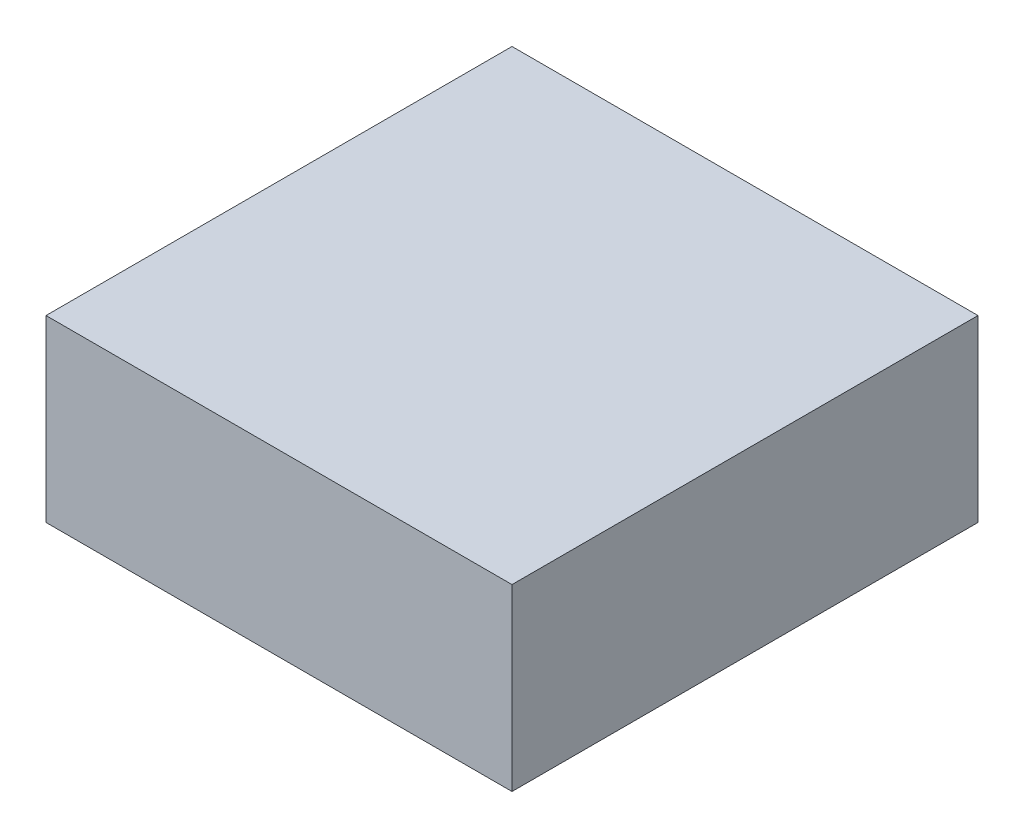
ISO-10303-21;
HEADER;
FILE_DESCRIPTION(('STEP AP214'),'2;1');
FILE_NAME('part.step','',(''),(''),'','','');
FILE_SCHEMA(('AUTOMOTIVE_DESIGN { 1 0 10303 214 1 1 1 1 }'));
ENDSEC;
DATA;
#1=APPLICATION_CONTEXT('core data for automotive mechanical design processes');
#2=APPLICATION_PROTOCOL_DEFINITION('international standard','automotive_design',2000,#1);
#3=PRODUCT_CONTEXT('',#1,'mechanical');
#4=PRODUCT('Part','Part','',(#3));
#5=PRODUCT_RELATED_PRODUCT_CATEGORY('part','',(#4));
#6=PRODUCT_DEFINITION_FORMATION('','',#4);
#7=PRODUCT_DEFINITION_CONTEXT('part definition',#1,'design');
#8=PRODUCT_DEFINITION('design','',#6,#7);
#9=PRODUCT_DEFINITION_SHAPE('','',#8);
#10=(LENGTH_UNIT() NAMED_UNIT(*) SI_UNIT(.MILLI.,.METRE.));
#11=(NAMED_UNIT(*) PLANE_ANGLE_UNIT() SI_UNIT($,.RADIAN.));
#12=(NAMED_UNIT(*) SI_UNIT($,.STERADIAN.) SOLID_ANGLE_UNIT());
#13=UNCERTAINTY_MEASURE_WITH_UNIT(LENGTH_MEASURE(1.E-05),#10,'distance_accuracy_value','');
#14=(GEOMETRIC_REPRESENTATION_CONTEXT(3) GLOBAL_UNCERTAINTY_ASSIGNED_CONTEXT((#13)) GLOBAL_UNIT_ASSIGNED_CONTEXT((#10,
#11,#12)) REPRESENTATION_CONTEXT('',''));
#15=CARTESIAN_POINT('',(0.,0.,0.));
#16=DIRECTION('',(0.,0.,1.));
#17=DIRECTION('',(1.,0.,0.));
#18=AXIS2_PLACEMENT_3D('',#15,#16,#17);
#19=CARTESIAN_POINT('',(-6.18906605922551,5.,-5.75968109339408));
#20=DIRECTION('',(1.,0.,0.));
#21=DIRECTION('',(0.,0.,-1.));
#22=AXIS2_PLACEMENT_3D('',#19,#20,#21);
#23=PLANE('',#22);
#24=DIRECTION('',(0.,0.,1.));
#25=VECTOR('',#24,1.);
#26=CARTESIAN_POINT('',(-6.18906605922551,0.,-5.75968109339408));
#27=LINE('',#26,#25);
#28=CARTESIAN_POINT('',(-6.18906605922551,0.,-5.75968109339408));
#29=VERTEX_POINT('',#28);
#30=CARTESIAN_POINT('',(-6.18906605922551,0.,7.24031890660592));
#31=VERTEX_POINT('',#30);
#32=EDGE_CURVE('E102',#29,#31,#27,.T.);
#33=ORIENTED_EDGE('',*,*,#32,.T.);
#34=DIRECTION('',(0.,-1.,0.));
#35=VECTOR('',#34,1.);
#36=CARTESIAN_POINT('',(-6.18906605922551,5.,7.24031890660592));
#37=LINE('',#36,#35);
#38=CARTESIAN_POINT('',(-6.18906605922551,5.,7.24031890660592));
#39=VERTEX_POINT('',#38);
#40=EDGE_CURVE('E11',#39,#31,#37,.T.);
#41=ORIENTED_EDGE('',*,*,#40,.F.);
#42=DIRECTION('',(0.,0.,1.));
#43=VECTOR('',#42,1.);
#44=CARTESIAN_POINT('',(-6.18906605922551,5.,-5.75968109339408));
#45=LINE('',#44,#43);
#46=CARTESIAN_POINT('',(-6.18906605922551,5.,-5.75968109339408));
#47=VERTEX_POINT('',#46);
#48=EDGE_CURVE('E90',#47,#39,#45,.T.);
#49=ORIENTED_EDGE('',*,*,#48,.F.);
#50=DIRECTION('',(0.,-1.,0.));
#51=VECTOR('',#50,1.);
#52=CARTESIAN_POINT('',(-6.18906605922551,5.,-5.75968109339408));
#53=LINE('',#52,#51);
#54=EDGE_CURVE('E98',#47,#29,#53,.T.);
#55=ORIENTED_EDGE('',*,*,#54,.T.);
#56=EDGE_LOOP('',(#33,#41,#49,#55));
#57=FACE_BOUND('',#56,.T.);
#58=ADVANCED_FACE('F39',(#57),#23,.F.);
#59=CARTESIAN_POINT('',(-6.18906605922551,5.,7.24031890660592));
#60=DIRECTION('',(0.,0.,-1.));
#61=DIRECTION('',(-1.,0.,0.));
#62=AXIS2_PLACEMENT_3D('',#59,#60,#61);
#63=PLANE('',#62);
#64=DIRECTION('',(1.,0.,0.));
#65=VECTOR('',#64,1.);
#66=CARTESIAN_POINT('',(-6.18906605922551,0.,7.24031890660592));
#67=LINE('',#66,#65);
#68=CARTESIAN_POINT('',(6.81093394077449,0.,7.24031890660592));
#69=VERTEX_POINT('',#68);
#70=EDGE_CURVE('E94',#31,#69,#67,.T.);
#71=ORIENTED_EDGE('',*,*,#70,.T.);
#72=DIRECTION('',(0.,-1.,0.));
#73=VECTOR('',#72,1.);
#74=CARTESIAN_POINT('',(6.81093394077449,5.,7.24031890660592));
#75=LINE('',#74,#73);
#76=CARTESIAN_POINT('',(6.81093394077449,5.,7.24031890660592));
#77=VERTEX_POINT('',#76);
#78=EDGE_CURVE('E47',#77,#69,#75,.T.);
#79=ORIENTED_EDGE('',*,*,#78,.F.);
#80=DIRECTION('',(1.,0.,0.));
#81=VECTOR('',#80,1.);
#82=CARTESIAN_POINT('',(-6.18906605922551,5.,7.24031890660592));
#83=LINE('',#82,#81);
#84=EDGE_CURVE('E85',#39,#77,#83,.T.);
#85=ORIENTED_EDGE('',*,*,#84,.F.);
#86=ORIENTED_EDGE('',*,*,#40,.T.);
#87=EDGE_LOOP('',(#71,#79,#85,#86));
#88=FACE_BOUND('',#87,.T.);
#89=ADVANCED_FACE('F93',(#88),#63,.F.);
#90=CARTESIAN_POINT('',(6.81093394077449,5.,-5.75968109339408));
#91=DIRECTION('',(-1.,0.,0.));
#92=DIRECTION('',(0.,0.,1.));
#93=AXIS2_PLACEMENT_3D('',#90,#91,#92);
#94=PLANE('',#93);
#95=DIRECTION('',(0.,0.,-1.));
#96=VECTOR('',#95,1.);
#97=CARTESIAN_POINT('',(6.81093394077449,0.,-5.75968109339408));
#98=LINE('',#97,#96);
#99=CARTESIAN_POINT('',(6.81093394077449,0.,-5.75968109339408));
#100=VERTEX_POINT('',#99);
#101=EDGE_CURVE('E72',#69,#100,#98,.T.);
#102=ORIENTED_EDGE('',*,*,#101,.T.);
#103=DIRECTION('',(0.,-1.,0.));
#104=VECTOR('',#103,1.);
#105=CARTESIAN_POINT('',(6.81093394077449,5.,-5.75968109339408));
#106=LINE('',#105,#104);
#107=CARTESIAN_POINT('',(6.81093394077449,5.,-5.75968109339408));
#108=VERTEX_POINT('',#107);
#109=EDGE_CURVE('E95',#108,#100,#106,.T.);
#110=ORIENTED_EDGE('',*,*,#109,.F.);
#111=DIRECTION('',(0.,0.,-1.));
#112=VECTOR('',#111,1.);
#113=CARTESIAN_POINT('',(6.81093394077449,5.,-5.75968109339408));
#114=LINE('',#113,#112);
#115=EDGE_CURVE('E88',#77,#108,#114,.T.);
#116=ORIENTED_EDGE('',*,*,#115,.F.);
#117=ORIENTED_EDGE('',*,*,#78,.T.);
#118=EDGE_LOOP('',(#102,#110,#116,#117));
#119=FACE_BOUND('',#118,.T.);
#120=ADVANCED_FACE('F96',(#119),#94,.F.);
#121=CARTESIAN_POINT('',(-6.18906605922551,5.,-5.75968109339408));
#122=DIRECTION('',(0.,0.,1.));
#123=DIRECTION('',(1.,0.,0.));
#124=AXIS2_PLACEMENT_3D('',#121,#122,#123);
#125=PLANE('',#124);
#126=DIRECTION('',(-1.,0.,0.));
#127=VECTOR('',#126,1.);
#128=CARTESIAN_POINT('',(-6.18906605922551,0.,-5.75968109339408));
#129=LINE('',#128,#127);
#130=EDGE_CURVE('E78',#100,#29,#129,.T.);
#131=ORIENTED_EDGE('',*,*,#130,.T.);
#132=ORIENTED_EDGE('',*,*,#54,.F.);
#133=DIRECTION('',(-1.,0.,0.));
#134=VECTOR('',#133,1.);
#135=CARTESIAN_POINT('',(-6.18906605922551,5.,-5.75968109339408));
#136=LINE('',#135,#134);
#137=EDGE_CURVE('E55',#108,#47,#136,.T.);
#138=ORIENTED_EDGE('',*,*,#137,.F.);
#139=ORIENTED_EDGE('',*,*,#109,.T.);
#140=EDGE_LOOP('',(#131,#132,#138,#139));
#141=FACE_BOUND('',#140,.T.);
#142=ADVANCED_FACE('F109',(#141),#125,.F.);
#143=CARTESIAN_POINT('',(0.,5.,0.));
#144=DIRECTION('',(0.,1.,0.));
#145=DIRECTION('',(0.,0.,1.));
#146=AXIS2_PLACEMENT_3D('',#143,#144,#145);
#147=PLANE('',#146);
#148=ORIENTED_EDGE('',*,*,#48,.T.);
#149=ORIENTED_EDGE('',*,*,#84,.T.);
#150=ORIENTED_EDGE('',*,*,#115,.T.);
#151=ORIENTED_EDGE('',*,*,#137,.T.);
#152=EDGE_LOOP('',(#148,#149,#150,#151));
#153=FACE_BOUND('',#152,.T.);
#154=ADVANCED_FACE('F86',(#153),#147,.T.);
#155=CARTESIAN_POINT('',(0.,0.,0.));
#156=DIRECTION('',(0.,1.,0.));
#157=DIRECTION('',(0.,0.,1.));
#158=AXIS2_PLACEMENT_3D('',#155,#156,#157);
#159=PLANE('',#158);
#160=ORIENTED_EDGE('',*,*,#32,.F.);
#161=ORIENTED_EDGE('',*,*,#130,.F.);
#162=ORIENTED_EDGE('',*,*,#101,.F.);
#163=ORIENTED_EDGE('',*,*,#70,.F.);
#164=EDGE_LOOP('',(#160,#161,#162,#163));
#165=FACE_BOUND('',#164,.T.);
#166=ADVANCED_FACE('F112',(#165),#159,.F.);
#167=CLOSED_SHELL('',(#58,#89,#120,#142,#154,#166));
#168=MANIFOLD_SOLID_BREP('B2',#167);
#169=ADVANCED_BREP_SHAPE_REPRESENTATION('',(#18,#168),#14);
#170=SHAPE_DEFINITION_REPRESENTATION(#9,#169);
ENDSEC;
END-ISO-10303-21;
